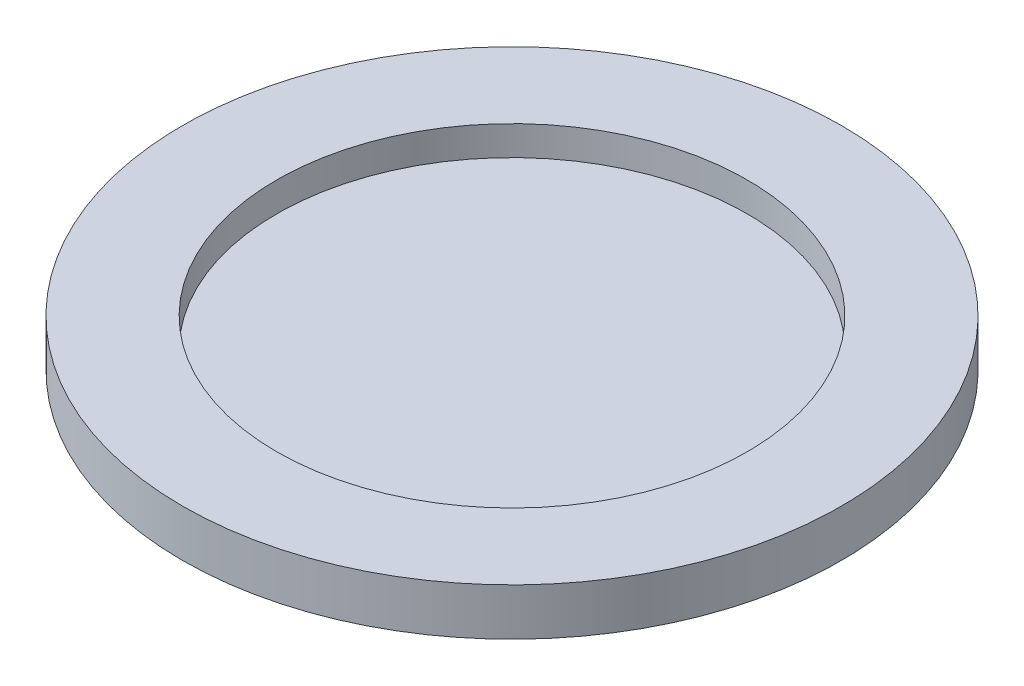
ISO-10303-21;
HEADER;
FILE_DESCRIPTION(('STEP AP214'),'2;1');
FILE_NAME('part.step','',(''),(''),'','','');
FILE_SCHEMA(('AUTOMOTIVE_DESIGN { 1 0 10303 214 1 1 1 1 }'));
ENDSEC;
DATA;
#1=APPLICATION_CONTEXT('core data for automotive mechanical design processes');
#2=APPLICATION_PROTOCOL_DEFINITION('international standard','automotive_design',2000,#1);
#3=PRODUCT_CONTEXT('',#1,'mechanical');
#4=PRODUCT('Part','Part','',(#3));
#5=PRODUCT_RELATED_PRODUCT_CATEGORY('part','',(#4));
#6=PRODUCT_DEFINITION_FORMATION('','',#4);
#7=PRODUCT_DEFINITION_CONTEXT('part definition',#1,'design');
#8=PRODUCT_DEFINITION('design','',#6,#7);
#9=PRODUCT_DEFINITION_SHAPE('','',#8);
#10=(LENGTH_UNIT() NAMED_UNIT(*) SI_UNIT(.MILLI.,.METRE.));
#11=(NAMED_UNIT(*) PLANE_ANGLE_UNIT() SI_UNIT($,.RADIAN.));
#12=(NAMED_UNIT(*) SI_UNIT($,.STERADIAN.) SOLID_ANGLE_UNIT());
#13=UNCERTAINTY_MEASURE_WITH_UNIT(LENGTH_MEASURE(1.E-05),#10,'distance_accuracy_value','');
#14=(GEOMETRIC_REPRESENTATION_CONTEXT(3) GLOBAL_UNCERTAINTY_ASSIGNED_CONTEXT((#13)) GLOBAL_UNIT_ASSIGNED_CONTEXT((#10,
#11,#12)) REPRESENTATION_CONTEXT('',''));
#15=CARTESIAN_POINT('',(0.,0.,0.));
#16=DIRECTION('',(0.,0.,1.));
#17=DIRECTION('',(1.,0.,0.));
#18=AXIS2_PLACEMENT_3D('',#15,#16,#17);
#19=CARTESIAN_POINT('',(0.,6.,0.));
#20=DIRECTION('',(0.,1.,0.));
#21=DIRECTION('',(0.,0.,1.));
#22=AXIS2_PLACEMENT_3D('',#19,#20,#21);
#23=PLANE('',#22);
#24=CARTESIAN_POINT('',(0.,6.,0.));
#25=DIRECTION('',(0.,1.,0.));
#26=DIRECTION('',(0.,0.,1.));
#27=AXIS2_PLACEMENT_3D('',#24,#25,#26);
#28=CIRCLE('',#27,56.);
#29=CARTESIAN_POINT('',(0.,6.,56.));
#30=VERTEX_POINT('',#29);
#31=EDGE_CURVE('E40',#30,#30,#28,.T.);
#32=ORIENTED_EDGE('',*,*,#31,.T.);
#33=EDGE_LOOP('',(#32));
#34=FACE_BOUND('',#33,.T.);
#35=CARTESIAN_POINT('',(0.,6.,0.));
#36=DIRECTION('',(0.,1.,0.));
#37=DIRECTION('',(0.,0.,1.));
#38=AXIS2_PLACEMENT_3D('',#35,#36,#37);
#39=CIRCLE('',#38,40.);
#40=CARTESIAN_POINT('',(0.,6.,40.));
#41=VERTEX_POINT('',#40);
#42=EDGE_CURVE('E44',#41,#41,#39,.T.);
#43=ORIENTED_EDGE('',*,*,#42,.F.);
#44=EDGE_LOOP('',(#43));
#45=FACE_BOUND('',#44,.T.);
#46=ADVANCED_FACE('F33',(#34,#45),#23,.T.);
#47=CARTESIAN_POINT('',(0.,6.,0.));
#48=DIRECTION('',(0.,-1.,0.));
#49=DIRECTION('',(0.,0.,-1.));
#50=AXIS2_PLACEMENT_3D('',#47,#48,#49);
#51=CYLINDRICAL_SURFACE('',#50,56.);
#52=ORIENTED_EDGE('',*,*,#31,.F.);
#53=EDGE_LOOP('',(#52));
#54=FACE_BOUND('',#53,.T.);
#55=CARTESIAN_POINT('',(0.,-2.,0.));
#56=DIRECTION('',(0.,-1.,0.));
#57=DIRECTION('',(0.,0.,-1.));
#58=AXIS2_PLACEMENT_3D('',#55,#56,#57);
#59=CIRCLE('',#58,56.);
#60=CARTESIAN_POINT('',(0.,-2.,-56.));
#61=VERTEX_POINT('',#60);
#62=EDGE_CURVE('E48',#61,#61,#59,.T.);
#63=ORIENTED_EDGE('',*,*,#62,.F.);
#64=EDGE_LOOP('',(#63));
#65=FACE_BOUND('',#64,.T.);
#66=ADVANCED_FACE('F35',(#54,#65),#51,.T.);
#67=CARTESIAN_POINT('',(0.,6.,0.));
#68=DIRECTION('',(0.,-1.,0.));
#69=DIRECTION('',(0.,0.,-1.));
#70=AXIS2_PLACEMENT_3D('',#67,#68,#69);
#71=CYLINDRICAL_SURFACE('',#70,40.);
#72=CARTESIAN_POINT('',(0.,1.,0.));
#73=DIRECTION('',(0.,1.,0.));
#74=DIRECTION('',(0.,0.,1.));
#75=AXIS2_PLACEMENT_3D('',#72,#73,#74);
#76=CIRCLE('',#75,40.);
#77=CARTESIAN_POINT('',(0.,1.,40.));
#78=VERTEX_POINT('',#77);
#79=EDGE_CURVE('E10',#78,#78,#76,.T.);
#80=ORIENTED_EDGE('',*,*,#79,.F.);
#81=EDGE_LOOP('',(#80));
#82=FACE_BOUND('',#81,.T.);
#83=ORIENTED_EDGE('',*,*,#42,.T.);
#84=EDGE_LOOP('',(#83));
#85=FACE_BOUND('',#84,.T.);
#86=ADVANCED_FACE('F57',(#82,#85),#71,.F.);
#87=CARTESIAN_POINT('',(0.,-2.,0.));
#88=DIRECTION('',(0.,-1.,0.));
#89=DIRECTION('',(0.,0.,-1.));
#90=AXIS2_PLACEMENT_3D('',#87,#88,#89);
#91=PLANE('',#90);
#92=ORIENTED_EDGE('',*,*,#62,.T.);
#93=EDGE_LOOP('',(#92));
#94=FACE_BOUND('',#93,.T.);
#95=ADVANCED_FACE('F54',(#94),#91,.T.);
#96=CARTESIAN_POINT('',(0.,1.,0.));
#97=DIRECTION('',(0.,1.,0.));
#98=DIRECTION('',(0.,0.,1.));
#99=AXIS2_PLACEMENT_3D('',#96,#97,#98);
#100=PLANE('',#99);
#101=ORIENTED_EDGE('',*,*,#79,.T.);
#102=EDGE_LOOP('',(#101));
#103=FACE_BOUND('',#102,.T.);
#104=ADVANCED_FACE('F71',(#103),#100,.T.);
#105=CLOSED_SHELL('',(#46,#66,#86,#95,#104));
#106=MANIFOLD_SOLID_BREP('B2',#105);
#107=ADVANCED_BREP_SHAPE_REPRESENTATION('',(#18,#106),#14);
#108=SHAPE_DEFINITION_REPRESENTATION(#9,#107);
ENDSEC;
END-ISO-10303-21;
